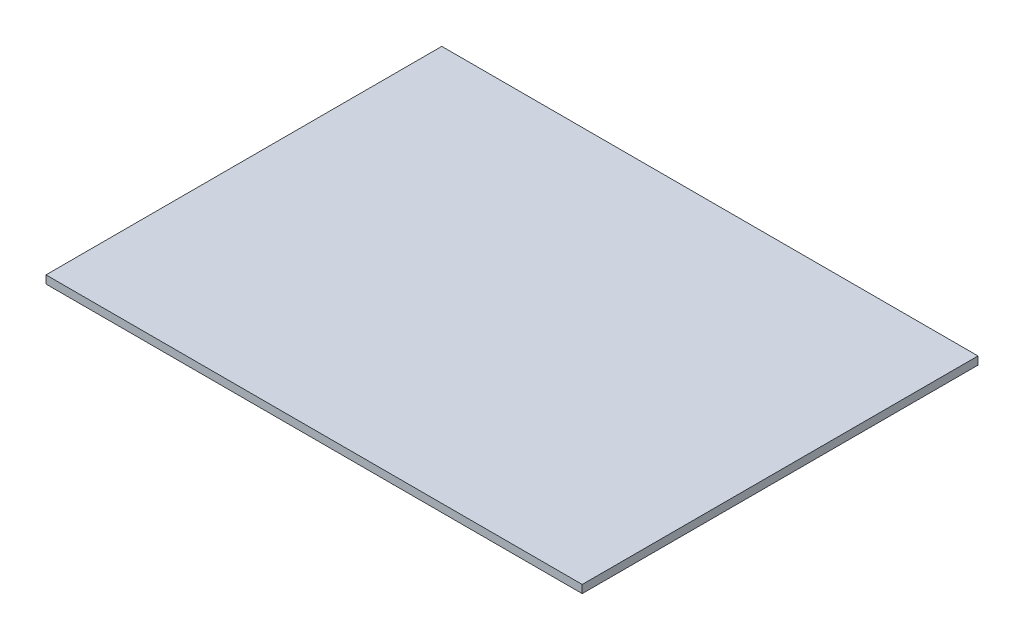
ISO-10303-21;
HEADER;
FILE_DESCRIPTION(('STEP AP214'),'2;1');
FILE_NAME('part.step','',(''),(''),'','','');
FILE_SCHEMA(('AUTOMOTIVE_DESIGN { 1 0 10303 214 1 1 1 1 }'));
ENDSEC;
DATA;
#1=APPLICATION_CONTEXT('core data for automotive mechanical design processes');
#2=APPLICATION_PROTOCOL_DEFINITION('international standard','automotive_design',2000,#1);
#3=PRODUCT_CONTEXT('',#1,'mechanical');
#4=PRODUCT('Part','Part','',(#3));
#5=PRODUCT_RELATED_PRODUCT_CATEGORY('part','',(#4));
#6=PRODUCT_DEFINITION_FORMATION('','',#4);
#7=PRODUCT_DEFINITION_CONTEXT('part definition',#1,'design');
#8=PRODUCT_DEFINITION('design','',#6,#7);
#9=PRODUCT_DEFINITION_SHAPE('','',#8);
#10=(LENGTH_UNIT() NAMED_UNIT(*) SI_UNIT(.MILLI.,.METRE.));
#11=(NAMED_UNIT(*) PLANE_ANGLE_UNIT() SI_UNIT($,.RADIAN.));
#12=(NAMED_UNIT(*) SI_UNIT($,.STERADIAN.) SOLID_ANGLE_UNIT());
#13=UNCERTAINTY_MEASURE_WITH_UNIT(LENGTH_MEASURE(1.E-05),#10,'distance_accuracy_value','');
#14=(GEOMETRIC_REPRESENTATION_CONTEXT(3) GLOBAL_UNCERTAINTY_ASSIGNED_CONTEXT((#13)) GLOBAL_UNIT_ASSIGNED_CONTEXT((#10,
#11,#12)) REPRESENTATION_CONTEXT('',''));
#15=CARTESIAN_POINT('',(0.,0.,0.));
#16=DIRECTION('',(0.,0.,1.));
#17=DIRECTION('',(1.,0.,0.));
#18=AXIS2_PLACEMENT_3D('',#15,#16,#17);
#19=CARTESIAN_POINT('',(-148.,5.,-124.));
#20=DIRECTION('',(0.,0.,1.));
#21=DIRECTION('',(1.,0.,0.));
#22=AXIS2_PLACEMENT_3D('',#19,#20,#21);
#23=PLANE('',#22);
#24=DIRECTION('',(-1.,0.,0.));
#25=VECTOR('',#24,1.);
#26=CARTESIAN_POINT('',(-148.,0.,-124.));
#27=LINE('',#26,#25);
#28=CARTESIAN_POINT('',(169.02566360872,0.,-124.));
#29=VERTEX_POINT('',#28);
#30=CARTESIAN_POINT('',(-166.97433639128,0.,-124.));
#31=VERTEX_POINT('',#30);
#32=EDGE_CURVE('E83',#29,#31,#27,.T.);
#33=ORIENTED_EDGE('',*,*,#32,.T.);
#34=DIRECTION('',(0.,-1.,0.));
#35=VECTOR('',#34,1.);
#36=CARTESIAN_POINT('',(-166.97433639128,5.,-124.));
#37=LINE('',#36,#35);
#38=CARTESIAN_POINT('',(-166.97433639128,5.,-124.));
#39=VERTEX_POINT('',#38);
#40=EDGE_CURVE('E11',#39,#31,#37,.T.);
#41=ORIENTED_EDGE('',*,*,#40,.F.);
#42=DIRECTION('',(-1.,0.,0.));
#43=VECTOR('',#42,1.);
#44=CARTESIAN_POINT('',(169.02566360872,5.,-124.));
#45=LINE('',#44,#43);
#46=CARTESIAN_POINT('',(169.02566360872,5.,-124.));
#47=VERTEX_POINT('',#46);
#48=EDGE_CURVE('E88',#47,#39,#45,.T.);
#49=ORIENTED_EDGE('',*,*,#48,.F.);
#50=DIRECTION('',(0.,-1.,0.));
#51=VECTOR('',#50,1.);
#52=CARTESIAN_POINT('',(169.02566360872,5.,-124.));
#53=LINE('',#52,#51);
#54=EDGE_CURVE('E108',#47,#29,#53,.T.);
#55=ORIENTED_EDGE('',*,*,#54,.T.);
#56=EDGE_LOOP('',(#33,#41,#49,#55));
#57=FACE_BOUND('',#56,.T.);
#58=ADVANCED_FACE('F43',(#57),#23,.F.);
#59=CARTESIAN_POINT('',(-166.97433639128,5.,-124.));
#60=DIRECTION('',(1.,0.,0.));
#61=DIRECTION('',(0.,0.,-1.));
#62=AXIS2_PLACEMENT_3D('',#59,#60,#61);
#63=PLANE('',#62);
#64=DIRECTION('',(0.,0.,1.));
#65=VECTOR('',#64,1.);
#66=CARTESIAN_POINT('',(-166.97433639128,0.,-124.));
#67=LINE('',#66,#65);
#68=CARTESIAN_POINT('',(-166.97433639128,0.,124.));
#69=VERTEX_POINT('',#68);
#70=EDGE_CURVE('E101',#31,#69,#67,.T.);
#71=ORIENTED_EDGE('',*,*,#70,.T.);
#72=DIRECTION('',(0.,-1.,0.));
#73=VECTOR('',#72,1.);
#74=CARTESIAN_POINT('',(-166.97433639128,5.,124.));
#75=LINE('',#74,#73);
#76=CARTESIAN_POINT('',(-166.97433639128,5.,124.));
#77=VERTEX_POINT('',#76);
#78=EDGE_CURVE('E52',#77,#69,#75,.T.);
#79=ORIENTED_EDGE('',*,*,#78,.F.);
#80=DIRECTION('',(0.,0.,1.));
#81=VECTOR('',#80,1.);
#82=CARTESIAN_POINT('',(-166.97433639128,5.,-124.));
#83=LINE('',#82,#81);
#84=EDGE_CURVE('E91',#39,#77,#83,.T.);
#85=ORIENTED_EDGE('',*,*,#84,.F.);
#86=ORIENTED_EDGE('',*,*,#40,.T.);
#87=EDGE_LOOP('',(#71,#79,#85,#86));
#88=FACE_BOUND('',#87,.T.);
#89=ADVANCED_FACE('F100',(#88),#63,.F.);
#90=CARTESIAN_POINT('',(148.,5.,124.));
#91=DIRECTION('',(0.,0.,-1.));
#92=DIRECTION('',(-1.,0.,0.));
#93=AXIS2_PLACEMENT_3D('',#90,#91,#92);
#94=PLANE('',#93);
#95=DIRECTION('',(1.,0.,0.));
#96=VECTOR('',#95,1.);
#97=CARTESIAN_POINT('',(148.,0.,124.));
#98=LINE('',#97,#96);
#99=CARTESIAN_POINT('',(169.02566360872,0.,124.));
#100=VERTEX_POINT('',#99);
#101=EDGE_CURVE('E76',#69,#100,#98,.T.);
#102=ORIENTED_EDGE('',*,*,#101,.T.);
#103=DIRECTION('',(0.,-1.,0.));
#104=VECTOR('',#103,1.);
#105=CARTESIAN_POINT('',(169.02566360872,5.,124.));
#106=LINE('',#105,#104);
#107=CARTESIAN_POINT('',(169.02566360872,5.,124.));
#108=VERTEX_POINT('',#107);
#109=EDGE_CURVE('E103',#108,#100,#106,.T.);
#110=ORIENTED_EDGE('',*,*,#109,.F.);
#111=DIRECTION('',(1.,0.,0.));
#112=VECTOR('',#111,1.);
#113=CARTESIAN_POINT('',(-166.97433639128,5.,124.));
#114=LINE('',#113,#112);
#115=EDGE_CURVE('E95',#77,#108,#114,.T.);
#116=ORIENTED_EDGE('',*,*,#115,.F.);
#117=ORIENTED_EDGE('',*,*,#78,.T.);
#118=EDGE_LOOP('',(#102,#110,#116,#117));
#119=FACE_BOUND('',#118,.T.);
#120=ADVANCED_FACE('F104',(#119),#94,.F.);
#121=CARTESIAN_POINT('',(169.02566360872,5.,124.));
#122=DIRECTION('',(-1.,0.,0.));
#123=DIRECTION('',(0.,0.,1.));
#124=AXIS2_PLACEMENT_3D('',#121,#122,#123);
#125=PLANE('',#124);
#126=DIRECTION('',(0.,0.,-1.));
#127=VECTOR('',#126,1.);
#128=CARTESIAN_POINT('',(169.02566360872,0.,124.));
#129=LINE('',#128,#127);
#130=EDGE_CURVE('E118',#100,#29,#129,.T.);
#131=ORIENTED_EDGE('',*,*,#130,.T.);
#132=ORIENTED_EDGE('',*,*,#54,.F.);
#133=DIRECTION('',(0.,0.,-1.));
#134=VECTOR('',#133,1.);
#135=CARTESIAN_POINT('',(169.02566360872,5.,124.));
#136=LINE('',#135,#134);
#137=EDGE_CURVE('E60',#108,#47,#136,.T.);
#138=ORIENTED_EDGE('',*,*,#137,.F.);
#139=ORIENTED_EDGE('',*,*,#109,.T.);
#140=EDGE_LOOP('',(#131,#132,#138,#139));
#141=FACE_BOUND('',#140,.T.);
#142=ADVANCED_FACE('F126',(#141),#125,.F.);
#143=CARTESIAN_POINT('',(0.,5.,0.));
#144=DIRECTION('',(0.,1.,0.));
#145=DIRECTION('',(0.,0.,1.));
#146=AXIS2_PLACEMENT_3D('',#143,#144,#145);
#147=PLANE('',#146);
#148=ORIENTED_EDGE('',*,*,#48,.T.);
#149=ORIENTED_EDGE('',*,*,#84,.T.);
#150=ORIENTED_EDGE('',*,*,#115,.T.);
#151=ORIENTED_EDGE('',*,*,#137,.T.);
#152=EDGE_LOOP('',(#148,#149,#150,#151));
#153=FACE_BOUND('',#152,.T.);
#154=ADVANCED_FACE('F93',(#153),#147,.T.);
#155=CARTESIAN_POINT('',(0.,0.,0.));
#156=DIRECTION('',(0.,1.,0.));
#157=DIRECTION('',(0.,0.,1.));
#158=AXIS2_PLACEMENT_3D('',#155,#156,#157);
#159=PLANE('',#158);
#160=ORIENTED_EDGE('',*,*,#32,.F.);
#161=ORIENTED_EDGE('',*,*,#130,.F.);
#162=ORIENTED_EDGE('',*,*,#101,.F.);
#163=ORIENTED_EDGE('',*,*,#70,.F.);
#164=EDGE_LOOP('',(#160,#161,#162,#163));
#165=FACE_BOUND('',#164,.T.);
#166=ADVANCED_FACE('F127',(#165),#159,.F.);
#167=CLOSED_SHELL('',(#58,#89,#120,#142,#154,#166));
#168=MANIFOLD_SOLID_BREP('B2',#167);
#169=ADVANCED_BREP_SHAPE_REPRESENTATION('',(#18,#168),#14);
#170=SHAPE_DEFINITION_REPRESENTATION(#9,#169);
ENDSEC;
END-ISO-10303-21;
